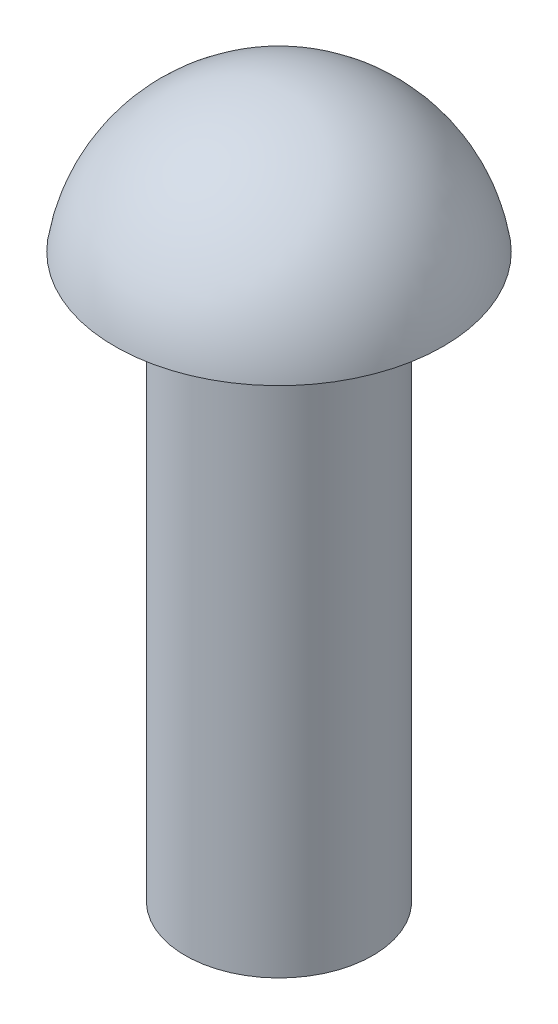
ISO-10303-21;
HEADER;
FILE_DESCRIPTION(('STEP AP214'),'2;1');
FILE_NAME('part.step','',(''),(''),'','','');
FILE_SCHEMA(('AUTOMOTIVE_DESIGN { 1 0 10303 214 1 1 1 1 }'));
ENDSEC;
DATA;
#1=APPLICATION_CONTEXT('core data for automotive mechanical design processes');
#2=APPLICATION_PROTOCOL_DEFINITION('international standard','automotive_design',2000,#1);
#3=PRODUCT_CONTEXT('',#1,'mechanical');
#4=PRODUCT('Part','Part','',(#3));
#5=PRODUCT_RELATED_PRODUCT_CATEGORY('part','',(#4));
#6=PRODUCT_DEFINITION_FORMATION('','',#4);
#7=PRODUCT_DEFINITION_CONTEXT('part definition',#1,'design');
#8=PRODUCT_DEFINITION('design','',#6,#7);
#9=PRODUCT_DEFINITION_SHAPE('','',#8);
#10=(LENGTH_UNIT() NAMED_UNIT(*) SI_UNIT(.MILLI.,.METRE.));
#11=(NAMED_UNIT(*) PLANE_ANGLE_UNIT() SI_UNIT($,.RADIAN.));
#12=(NAMED_UNIT(*) SI_UNIT($,.STERADIAN.) SOLID_ANGLE_UNIT());
#13=UNCERTAINTY_MEASURE_WITH_UNIT(LENGTH_MEASURE(1.E-05),#10,'distance_accuracy_value','');
#14=(GEOMETRIC_REPRESENTATION_CONTEXT(3) GLOBAL_UNCERTAINTY_ASSIGNED_CONTEXT((#13)) GLOBAL_UNIT_ASSIGNED_CONTEXT((#10,
#11,#12)) REPRESENTATION_CONTEXT('',''));
#15=CARTESIAN_POINT('',(0.,0.,0.));
#16=DIRECTION('',(0.,0.,1.));
#17=DIRECTION('',(1.,0.,0.));
#18=AXIS2_PLACEMENT_3D('',#15,#16,#17);
#19=CARTESIAN_POINT('',(0.,0.,0.));
#20=DIRECTION('',(0.,-1.,0.));
#21=DIRECTION('',(0.,0.,-1.));
#22=AXIS2_PLACEMENT_3D('',#19,#20,#21);
#23=PLANE('',#22);
#24=CARTESIAN_POINT('',(0.,0.,0.));
#25=DIRECTION('',(0.,-1.,0.));
#26=DIRECTION('',(0.,0.,-1.));
#27=AXIS2_PLACEMENT_3D('',#24,#25,#26);
#28=CIRCLE('',#27,6.35);
#29=CARTESIAN_POINT('',(0.,0.,-6.35));
#30=VERTEX_POINT('',#29);
#31=EDGE_CURVE('E10',#30,#30,#28,.T.);
#32=ORIENTED_EDGE('',*,*,#31,.T.);
#33=EDGE_LOOP('',(#32));
#34=FACE_BOUND('',#33,.T.);
#35=ADVANCED_FACE('F41',(#34),#23,.T.);
#36=CARTESIAN_POINT('',(0.,0.,0.));
#37=DIRECTION('',(0.,-1.,0.));
#38=DIRECTION('',(0.,0.,-1.));
#39=AXIS2_PLACEMENT_3D('',#36,#37,#38);
#40=CYLINDRICAL_SURFACE('',#39,6.35);
#41=CARTESIAN_POINT('',(0.,38.1,0.));
#42=DIRECTION('',(0.,-1.,0.));
#43=DIRECTION('',(0.,0.,-1.));
#44=AXIS2_PLACEMENT_3D('',#41,#42,#43);
#45=CIRCLE('',#44,6.35);
#46=CARTESIAN_POINT('',(0.,38.1,-6.35));
#47=VERTEX_POINT('',#46);
#48=EDGE_CURVE('E48',#47,#47,#45,.T.);
#49=ORIENTED_EDGE('',*,*,#48,.T.);
#50=EDGE_LOOP('',(#49));
#51=FACE_BOUND('',#50,.T.);
#52=ORIENTED_EDGE('',*,*,#31,.F.);
#53=EDGE_LOOP('',(#52));
#54=FACE_BOUND('',#53,.T.);
#55=ADVANCED_FACE('F70',(#51,#54),#40,.T.);
#56=CARTESIAN_POINT('',(6.35,38.1,0.));
#57=DIRECTION('',(0.,-1.,0.));
#58=DIRECTION('',(0.,0.,-1.));
#59=AXIS2_PLACEMENT_3D('',#56,#57,#58);
#60=PLANE('',#59);
#61=CARTESIAN_POINT('',(0.,38.1,0.));
#62=DIRECTION('',(0.,-1.,0.));
#63=DIRECTION('',(0.,0.,-1.));
#64=AXIS2_PLACEMENT_3D('',#61,#62,#63);
#65=CIRCLE('',#64,11.1188481867503);
#66=CARTESIAN_POINT('',(0.,38.1,-11.1188481867503));
#67=VERTEX_POINT('',#66);
#68=EDGE_CURVE('E53',#67,#67,#65,.T.);
#69=ORIENTED_EDGE('',*,*,#68,.T.);
#70=EDGE_LOOP('',(#69));
#71=FACE_BOUND('',#70,.T.);
#72=ORIENTED_EDGE('',*,*,#48,.F.);
#73=EDGE_LOOP('',(#72));
#74=FACE_BOUND('',#73,.T.);
#75=ADVANCED_FACE('F61',(#71,#74),#60,.T.);
#76=CARTESIAN_POINT('',(0.,36.3728,0.));
#77=DIRECTION('',(0.,-1.,0.));
#78=DIRECTION('',(1.,0.,0.));
#79=AXIS2_PLACEMENT_3D('',#76,#77,#78);
#80=SPHERICAL_SURFACE('',#79,11.2522);
#81=ORIENTED_EDGE('',*,*,#68,.F.);
#82=EDGE_LOOP('',(#81));
#83=FACE_BOUND('',#82,.T.);
#84=ADVANCED_FACE('F64',(#83),#80,.T.);
#85=CLOSED_SHELL('',(#35,#55,#75,#84));
#86=MANIFOLD_SOLID_BREP('B2',#85);
#87=ADVANCED_BREP_SHAPE_REPRESENTATION('',(#18,#86),#14);
#88=SHAPE_DEFINITION_REPRESENTATION(#9,#87);
ENDSEC;
END-ISO-10303-21;
